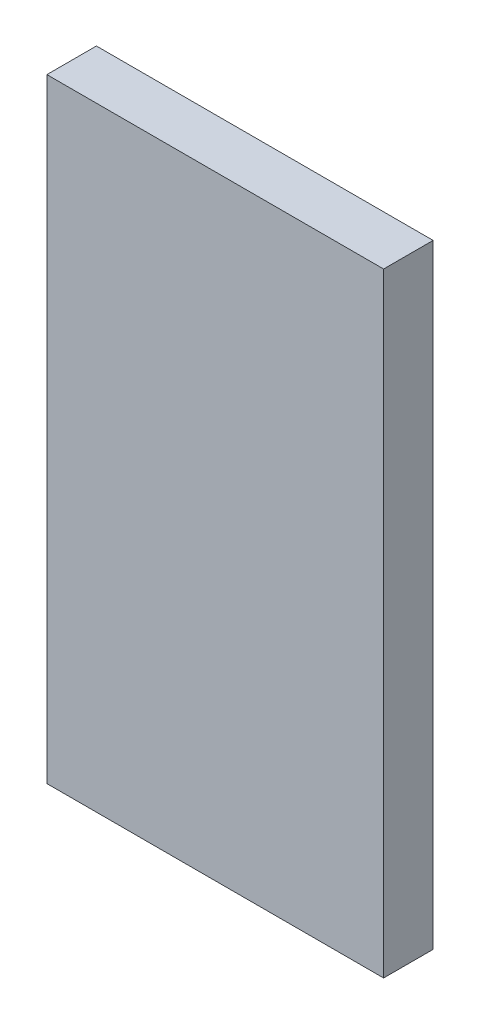
ISO-10303-21;
HEADER;
FILE_DESCRIPTION(('STEP AP214'),'2;1');
FILE_NAME('part.step','',(''),(''),'','','');
FILE_SCHEMA(('AUTOMOTIVE_DESIGN { 1 0 10303 214 1 1 1 1 }'));
ENDSEC;
DATA;
#1=APPLICATION_CONTEXT('core data for automotive mechanical design processes');
#2=APPLICATION_PROTOCOL_DEFINITION('international standard','automotive_design',2000,#1);
#3=PRODUCT_CONTEXT('',#1,'mechanical');
#4=PRODUCT('Part','Part','',(#3));
#5=PRODUCT_RELATED_PRODUCT_CATEGORY('part','',(#4));
#6=PRODUCT_DEFINITION_FORMATION('','',#4);
#7=PRODUCT_DEFINITION_CONTEXT('part definition',#1,'design');
#8=PRODUCT_DEFINITION('design','',#6,#7);
#9=PRODUCT_DEFINITION_SHAPE('','',#8);
#10=(LENGTH_UNIT() NAMED_UNIT(*) SI_UNIT(.MILLI.,.METRE.));
#11=(NAMED_UNIT(*) PLANE_ANGLE_UNIT() SI_UNIT($,.RADIAN.));
#12=(NAMED_UNIT(*) SI_UNIT($,.STERADIAN.) SOLID_ANGLE_UNIT());
#13=UNCERTAINTY_MEASURE_WITH_UNIT(LENGTH_MEASURE(1.E-05),#10,'distance_accuracy_value','');
#14=(GEOMETRIC_REPRESENTATION_CONTEXT(3) GLOBAL_UNCERTAINTY_ASSIGNED_CONTEXT((#13)) GLOBAL_UNIT_ASSIGNED_CONTEXT((#10,
#11,#12)) REPRESENTATION_CONTEXT('',''));
#15=CARTESIAN_POINT('',(0.,0.,0.));
#16=DIRECTION('',(0.,0.,1.));
#17=DIRECTION('',(1.,0.,0.));
#18=AXIS2_PLACEMENT_3D('',#15,#16,#17);
#19=CARTESIAN_POINT('',(-14.027799972448,8.84873949579831,5.));
#20=DIRECTION('',(1.,0.,0.));
#21=DIRECTION('',(0.,1.,0.));
#22=AXIS2_PLACEMENT_3D('',#19,#20,#21);
#23=PLANE('',#22);
#24=DIRECTION('',(0.,-1.,0.));
#25=VECTOR('',#24,1.);
#26=CARTESIAN_POINT('',(-14.027799972448,8.84873949579831,0.));
#27=LINE('',#26,#25);
#28=CARTESIAN_POINT('',(-14.027799972448,8.84873949579831,0.));
#29=VERTEX_POINT('',#28);
#30=CARTESIAN_POINT('',(-14.027799972448,-53.1512605042017,0.));
#31=VERTEX_POINT('',#30);
#32=EDGE_CURVE('E96',#29,#31,#27,.T.);
#33=ORIENTED_EDGE('',*,*,#32,.T.);
#34=DIRECTION('',(0.,0.,-1.));
#35=VECTOR('',#34,1.);
#36=CARTESIAN_POINT('',(-14.027799972448,-53.1512605042017,5.));
#37=LINE('',#36,#35);
#38=CARTESIAN_POINT('',(-14.027799972448,-53.1512605042017,5.));
#39=VERTEX_POINT('',#38);
#40=EDGE_CURVE('E11',#39,#31,#37,.T.);
#41=ORIENTED_EDGE('',*,*,#40,.F.);
#42=DIRECTION('',(0.,-1.,0.));
#43=VECTOR('',#42,1.);
#44=CARTESIAN_POINT('',(-14.027799972448,8.84873949579831,5.));
#45=LINE('',#44,#43);
#46=CARTESIAN_POINT('',(-14.027799972448,8.84873949579831,5.));
#47=VERTEX_POINT('',#46);
#48=EDGE_CURVE('E84',#47,#39,#45,.T.);
#49=ORIENTED_EDGE('',*,*,#48,.F.);
#50=DIRECTION('',(0.,0.,-1.));
#51=VECTOR('',#50,1.);
#52=CARTESIAN_POINT('',(-14.027799972448,8.84873949579831,5.));
#53=LINE('',#52,#51);
#54=EDGE_CURVE('E92',#47,#29,#53,.T.);
#55=ORIENTED_EDGE('',*,*,#54,.T.);
#56=EDGE_LOOP('',(#33,#41,#49,#55));
#57=FACE_BOUND('',#56,.T.);
#58=ADVANCED_FACE('F33',(#57),#23,.F.);
#59=CARTESIAN_POINT('',(-14.027799972448,-53.1512605042017,5.));
#60=DIRECTION('',(0.,1.,0.));
#61=DIRECTION('',(0.,0.,1.));
#62=AXIS2_PLACEMENT_3D('',#59,#60,#61);
#63=PLANE('',#62);
#64=DIRECTION('',(1.,0.,0.));
#65=VECTOR('',#64,1.);
#66=CARTESIAN_POINT('',(-14.027799972448,-53.1512605042017,0.));
#67=LINE('',#66,#65);
#68=CARTESIAN_POINT('',(19.972200027552,-53.1512605042017,0.));
#69=VERTEX_POINT('',#68);
#70=EDGE_CURVE('E88',#31,#69,#67,.T.);
#71=ORIENTED_EDGE('',*,*,#70,.T.);
#72=DIRECTION('',(0.,0.,-1.));
#73=VECTOR('',#72,1.);
#74=CARTESIAN_POINT('',(19.972200027552,-53.1512605042017,5.));
#75=LINE('',#74,#73);
#76=CARTESIAN_POINT('',(19.972200027552,-53.1512605042017,5.));
#77=VERTEX_POINT('',#76);
#78=EDGE_CURVE('E41',#77,#69,#75,.T.);
#79=ORIENTED_EDGE('',*,*,#78,.F.);
#80=DIRECTION('',(1.,0.,0.));
#81=VECTOR('',#80,1.);
#82=CARTESIAN_POINT('',(-14.027799972448,-53.1512605042017,5.));
#83=LINE('',#82,#81);
#84=EDGE_CURVE('E79',#39,#77,#83,.T.);
#85=ORIENTED_EDGE('',*,*,#84,.F.);
#86=ORIENTED_EDGE('',*,*,#40,.T.);
#87=EDGE_LOOP('',(#71,#79,#85,#86));
#88=FACE_BOUND('',#87,.T.);
#89=ADVANCED_FACE('F87',(#88),#63,.F.);
#90=CARTESIAN_POINT('',(19.972200027552,8.84873949579831,5.));
#91=DIRECTION('',(-1.,0.,0.));
#92=DIRECTION('',(0.,-1.,0.));
#93=AXIS2_PLACEMENT_3D('',#90,#91,#92);
#94=PLANE('',#93);
#95=DIRECTION('',(0.,1.,0.));
#96=VECTOR('',#95,1.);
#97=CARTESIAN_POINT('',(19.972200027552,8.84873949579831,0.));
#98=LINE('',#97,#96);
#99=CARTESIAN_POINT('',(19.972200027552,8.84873949579831,0.));
#100=VERTEX_POINT('',#99);
#101=EDGE_CURVE('E66',#69,#100,#98,.T.);
#102=ORIENTED_EDGE('',*,*,#101,.T.);
#103=DIRECTION('',(0.,0.,-1.));
#104=VECTOR('',#103,1.);
#105=CARTESIAN_POINT('',(19.972200027552,8.84873949579831,5.));
#106=LINE('',#105,#104);
#107=CARTESIAN_POINT('',(19.972200027552,8.84873949579831,5.));
#108=VERTEX_POINT('',#107);
#109=EDGE_CURVE('E89',#108,#100,#106,.T.);
#110=ORIENTED_EDGE('',*,*,#109,.F.);
#111=DIRECTION('',(0.,1.,0.));
#112=VECTOR('',#111,1.);
#113=CARTESIAN_POINT('',(19.972200027552,8.84873949579831,5.));
#114=LINE('',#113,#112);
#115=EDGE_CURVE('E82',#77,#108,#114,.T.);
#116=ORIENTED_EDGE('',*,*,#115,.F.);
#117=ORIENTED_EDGE('',*,*,#78,.T.);
#118=EDGE_LOOP('',(#102,#110,#116,#117));
#119=FACE_BOUND('',#118,.T.);
#120=ADVANCED_FACE('F90',(#119),#94,.F.);
#121=CARTESIAN_POINT('',(-14.027799972448,8.84873949579831,5.));
#122=DIRECTION('',(0.,-1.,0.));
#123=DIRECTION('',(0.,0.,-1.));
#124=AXIS2_PLACEMENT_3D('',#121,#122,#123);
#125=PLANE('',#124);
#126=DIRECTION('',(-1.,0.,0.));
#127=VECTOR('',#126,1.);
#128=CARTESIAN_POINT('',(-14.027799972448,8.84873949579831,0.));
#129=LINE('',#128,#127);
#130=EDGE_CURVE('E72',#100,#29,#129,.T.);
#131=ORIENTED_EDGE('',*,*,#130,.T.);
#132=ORIENTED_EDGE('',*,*,#54,.F.);
#133=DIRECTION('',(-1.,0.,0.));
#134=VECTOR('',#133,1.);
#135=CARTESIAN_POINT('',(-14.027799972448,8.84873949579831,5.));
#136=LINE('',#135,#134);
#137=EDGE_CURVE('E49',#108,#47,#136,.T.);
#138=ORIENTED_EDGE('',*,*,#137,.F.);
#139=ORIENTED_EDGE('',*,*,#109,.T.);
#140=EDGE_LOOP('',(#131,#132,#138,#139));
#141=FACE_BOUND('',#140,.T.);
#142=ADVANCED_FACE('F103',(#141),#125,.F.);
#143=CARTESIAN_POINT('',(0.,0.,5.));
#144=DIRECTION('',(0.,0.,1.));
#145=DIRECTION('',(1.,0.,0.));
#146=AXIS2_PLACEMENT_3D('',#143,#144,#145);
#147=PLANE('',#146);
#148=ORIENTED_EDGE('',*,*,#48,.T.);
#149=ORIENTED_EDGE('',*,*,#84,.T.);
#150=ORIENTED_EDGE('',*,*,#115,.T.);
#151=ORIENTED_EDGE('',*,*,#137,.T.);
#152=EDGE_LOOP('',(#148,#149,#150,#151));
#153=FACE_BOUND('',#152,.T.);
#154=ADVANCED_FACE('F80',(#153),#147,.T.);
#155=CARTESIAN_POINT('',(0.,0.,0.));
#156=DIRECTION('',(0.,0.,1.));
#157=DIRECTION('',(1.,0.,0.));
#158=AXIS2_PLACEMENT_3D('',#155,#156,#157);
#159=PLANE('',#158);
#160=ORIENTED_EDGE('',*,*,#32,.F.);
#161=ORIENTED_EDGE('',*,*,#130,.F.);
#162=ORIENTED_EDGE('',*,*,#101,.F.);
#163=ORIENTED_EDGE('',*,*,#70,.F.);
#164=EDGE_LOOP('',(#160,#161,#162,#163));
#165=FACE_BOUND('',#164,.T.);
#166=ADVANCED_FACE('F106',(#165),#159,.F.);
#167=CLOSED_SHELL('',(#58,#89,#120,#142,#154,#166));
#168=MANIFOLD_SOLID_BREP('B2',#167);
#169=ADVANCED_BREP_SHAPE_REPRESENTATION('',(#18,#168),#14);
#170=SHAPE_DEFINITION_REPRESENTATION(#9,#169);
ENDSEC;
END-ISO-10303-21;
